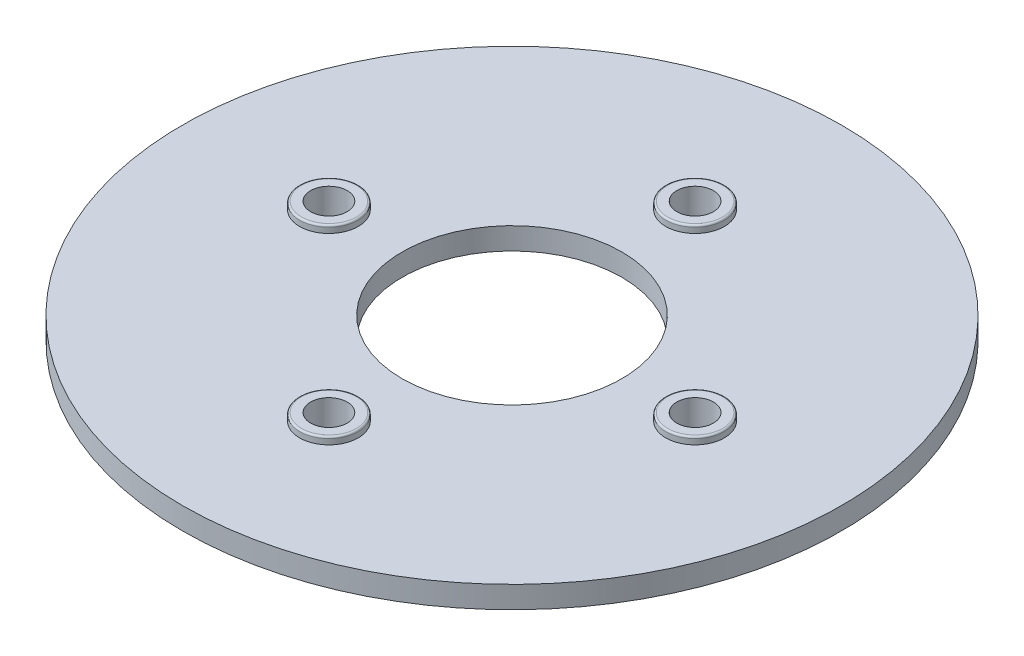
ISO-10303-21;
HEADER;
FILE_DESCRIPTION(('STEP AP214'),'2;1');
FILE_NAME('part.step','',(''),(''),'','','');
FILE_SCHEMA(('AUTOMOTIVE_DESIGN { 1 0 10303 214 1 1 1 1 }'));
ENDSEC;
DATA;
#1=APPLICATION_CONTEXT('core data for automotive mechanical design processes');
#2=APPLICATION_PROTOCOL_DEFINITION('international standard','automotive_design',2000,#1);
#3=PRODUCT_CONTEXT('',#1,'mechanical');
#4=PRODUCT('Part','Part','',(#3));
#5=PRODUCT_RELATED_PRODUCT_CATEGORY('part','',(#4));
#6=PRODUCT_DEFINITION_FORMATION('','',#4);
#7=PRODUCT_DEFINITION_CONTEXT('part definition',#1,'design');
#8=PRODUCT_DEFINITION('design','',#6,#7);
#9=PRODUCT_DEFINITION_SHAPE('','',#8);
#10=(LENGTH_UNIT() NAMED_UNIT(*) SI_UNIT(.MILLI.,.METRE.));
#11=(NAMED_UNIT(*) PLANE_ANGLE_UNIT() SI_UNIT($,.RADIAN.));
#12=(NAMED_UNIT(*) SI_UNIT($,.STERADIAN.) SOLID_ANGLE_UNIT());
#13=UNCERTAINTY_MEASURE_WITH_UNIT(LENGTH_MEASURE(1.E-05),#10,'distance_accuracy_value','');
#14=(GEOMETRIC_REPRESENTATION_CONTEXT(3) GLOBAL_UNCERTAINTY_ASSIGNED_CONTEXT((#13)) GLOBAL_UNIT_ASSIGNED_CONTEXT((#10,
#11,#12)) REPRESENTATION_CONTEXT('',''));
#15=CARTESIAN_POINT('',(0.,0.,0.));
#16=DIRECTION('',(0.,0.,1.));
#17=DIRECTION('',(1.,0.,0.));
#18=AXIS2_PLACEMENT_3D('',#15,#16,#17);
#19=CARTESIAN_POINT('',(0.,3.,0.));
#20=DIRECTION('',(0.,1.,0.));
#21=DIRECTION('',(0.,0.,1.));
#22=AXIS2_PLACEMENT_3D('',#19,#20,#21);
#23=PLANE('',#22);
#24=CARTESIAN_POINT('',(-1.58647468746875E-12,3.,25.));
#25=DIRECTION('',(0.,1.,0.));
#26=DIRECTION('',(0.,0.,1.));
#27=AXIS2_PLACEMENT_3D('',#24,#25,#26);
#28=CIRCLE('',#27,4.);
#29=CARTESIAN_POINT('',(-1.58647468746875E-12,3.,29.));
#30=VERTEX_POINT('',#29);
#31=EDGE_CURVE('E97',#30,#30,#28,.T.);
#32=ORIENTED_EDGE('',*,*,#31,.F.);
#33=EDGE_LOOP('',(#32));
#34=FACE_BOUND('',#33,.T.);
#35=CARTESIAN_POINT('',(-25.,3.,-1.67376172093983E-12));
#36=DIRECTION('',(0.,1.,0.));
#37=DIRECTION('',(0.,0.,1.));
#38=AXIS2_PLACEMENT_3D('',#35,#36,#37);
#39=CIRCLE('',#38,4.);
#40=CARTESIAN_POINT('',(-25.,3.,3.99999999999833));
#41=VERTEX_POINT('',#40);
#42=EDGE_CURVE('E91',#41,#41,#39,.T.);
#43=ORIENTED_EDGE('',*,*,#42,.F.);
#44=EDGE_LOOP('',(#43));
#45=FACE_BOUND('',#44,.T.);
#46=CARTESIAN_POINT('',(0.,3.,0.));
#47=DIRECTION('',(0.,1.,0.));
#48=DIRECTION('',(0.,0.,1.));
#49=AXIS2_PLACEMENT_3D('',#46,#47,#48);
#50=CIRCLE('',#49,45.);
#51=CARTESIAN_POINT('',(0.,3.,45.));
#52=VERTEX_POINT('',#51);
#53=EDGE_CURVE('E70',#52,#52,#50,.T.);
#54=ORIENTED_EDGE('',*,*,#53,.T.);
#55=EDGE_LOOP('',(#54));
#56=FACE_BOUND('',#55,.T.);
#57=CARTESIAN_POINT('',(0.,3.,0.));
#58=DIRECTION('',(0.,1.,0.));
#59=DIRECTION('',(0.,0.,1.));
#60=AXIS2_PLACEMENT_3D('',#57,#58,#59);
#61=CIRCLE('',#60,15.);
#62=CARTESIAN_POINT('',(0.,3.,15.));
#63=VERTEX_POINT('',#62);
#64=EDGE_CURVE('E66',#63,#63,#61,.T.);
#65=ORIENTED_EDGE('',*,*,#64,.F.);
#66=EDGE_LOOP('',(#65));
#67=FACE_BOUND('',#66,.T.);
#68=CARTESIAN_POINT('',(25.,3.,1.49918765399767E-12));
#69=DIRECTION('',(0.,1.,0.));
#70=DIRECTION('',(0.,0.,1.));
#71=AXIS2_PLACEMENT_3D('',#68,#69,#70);
#72=CIRCLE('',#71,4.);
#73=CARTESIAN_POINT('',(25.,3.,4.0000000000015));
#74=VERTEX_POINT('',#73);
#75=EDGE_CURVE('E103',#74,#74,#72,.T.);
#76=ORIENTED_EDGE('',*,*,#75,.F.);
#77=EDGE_LOOP('',(#76));
#78=FACE_BOUND('',#77,.T.);
#79=CARTESIAN_POINT('',(1.4119006205266E-12,3.,-25.));
#80=DIRECTION('',(0.,1.,0.));
#81=DIRECTION('',(0.,0.,1.));
#82=AXIS2_PLACEMENT_3D('',#79,#80,#81);
#83=CIRCLE('',#82,4.);
#84=CARTESIAN_POINT('',(1.4119006205266E-12,3.,-21.));
#85=VERTEX_POINT('',#84);
#86=EDGE_CURVE('E109',#85,#85,#83,.T.);
#87=ORIENTED_EDGE('',*,*,#86,.F.);
#88=EDGE_LOOP('',(#87));
#89=FACE_BOUND('',#88,.T.);
#90=ADVANCED_FACE('F34',(#34,#45,#56,#67,#78,#89),#23,.T.);
#91=CARTESIAN_POINT('',(0.,3.,0.));
#92=DIRECTION('',(0.,-1.,0.));
#93=DIRECTION('',(0.,0.,-1.));
#94=AXIS2_PLACEMENT_3D('',#91,#92,#93);
#95=CYLINDRICAL_SURFACE('',#94,45.);
#96=ORIENTED_EDGE('',*,*,#53,.F.);
#97=EDGE_LOOP('',(#96));
#98=FACE_BOUND('',#97,.T.);
#99=CARTESIAN_POINT('',(0.,0.,0.));
#100=DIRECTION('',(0.,1.,0.));
#101=DIRECTION('',(0.,0.,1.));
#102=AXIS2_PLACEMENT_3D('',#99,#100,#101);
#103=CIRCLE('',#102,45.);
#104=CARTESIAN_POINT('',(0.,0.,45.));
#105=VERTEX_POINT('',#104);
#106=EDGE_CURVE('E71',#105,#105,#103,.T.);
#107=ORIENTED_EDGE('',*,*,#106,.T.);
#108=EDGE_LOOP('',(#107));
#109=FACE_BOUND('',#108,.T.);
#110=ADVANCED_FACE('F135',(#98,#109),#95,.T.);
#111=CARTESIAN_POINT('',(1.4119006205266E-12,3.,25.));
#112=DIRECTION('',(0.,-1.,0.));
#113=DIRECTION('',(0.,0.,-1.));
#114=AXIS2_PLACEMENT_3D('',#111,#112,#113);
#115=CYLINDRICAL_SURFACE('',#114,2.50000000000152);
#116=CARTESIAN_POINT('',(1.4119006205266E-12,0.,25.));
#117=DIRECTION('',(0.,1.,0.));
#118=DIRECTION('',(0.,0.,1.));
#119=AXIS2_PLACEMENT_3D('',#116,#117,#118);
#120=CIRCLE('',#119,2.50000000000152);
#121=CARTESIAN_POINT('',(1.4119006205266E-12,0.,27.5000000000015));
#122=VERTEX_POINT('',#121);
#123=EDGE_CURVE('E74',#122,#122,#120,.T.);
#124=ORIENTED_EDGE('',*,*,#123,.F.);
#125=EDGE_LOOP('',(#124));
#126=FACE_BOUND('',#125,.T.);
#127=CARTESIAN_POINT('',(1.4119006205266E-12,4.,25.));
#128=DIRECTION('',(0.,1.,0.));
#129=DIRECTION('',(0.,0.,1.));
#130=AXIS2_PLACEMENT_3D('',#127,#128,#129);
#131=CIRCLE('',#130,2.50000000000152);
#132=CARTESIAN_POINT('',(1.4119006205266E-12,4.,27.5000000000015));
#133=VERTEX_POINT('',#132);
#134=EDGE_CURVE('E94',#133,#133,#131,.F.);
#135=ORIENTED_EDGE('',*,*,#134,.F.);
#136=EDGE_LOOP('',(#135));
#137=FACE_BOUND('',#136,.T.);
#138=ADVANCED_FACE('F130',(#126,#137),#115,.F.);
#139=CARTESIAN_POINT('',(25.0000000000007,3.,-7.05950310263298E-13));
#140=DIRECTION('',(0.,-1.,0.));
#141=DIRECTION('',(0.,0.,-1.));
#142=AXIS2_PLACEMENT_3D('',#139,#140,#141);
#143=CYLINDRICAL_SURFACE('',#142,2.50000000000055);
#144=CARTESIAN_POINT('',(25.0000000000007,0.,-7.05950310263298E-13));
#145=DIRECTION('',(0.,1.,0.));
#146=DIRECTION('',(0.,0.,1.));
#147=AXIS2_PLACEMENT_3D('',#144,#145,#146);
#148=CIRCLE('',#147,2.50000000000055);
#149=CARTESIAN_POINT('',(25.0000000000007,0.,2.49999999999985));
#150=VERTEX_POINT('',#149);
#151=EDGE_CURVE('E77',#150,#150,#148,.T.);
#152=ORIENTED_EDGE('',*,*,#151,.F.);
#153=EDGE_LOOP('',(#152));
#154=FACE_BOUND('',#153,.T.);
#155=CARTESIAN_POINT('',(25.0000000000007,4.,-7.05950310263298E-13));
#156=DIRECTION('',(0.,1.,0.));
#157=DIRECTION('',(0.,0.,1.));
#158=AXIS2_PLACEMENT_3D('',#155,#156,#157);
#159=CIRCLE('',#158,2.50000000000055);
#160=CARTESIAN_POINT('',(25.0000000000007,4.,2.49999999999985));
#161=VERTEX_POINT('',#160);
#162=EDGE_CURVE('E100',#161,#161,#159,.F.);
#163=ORIENTED_EDGE('',*,*,#162,.F.);
#164=EDGE_LOOP('',(#163));
#165=FACE_BOUND('',#164,.T.);
#166=ADVANCED_FACE('F120',(#154,#165),#143,.F.);
#167=CARTESIAN_POINT('',(0.,3.,-25.));
#168=DIRECTION('',(0.,-1.,0.));
#169=DIRECTION('',(0.,0.,-1.));
#170=AXIS2_PLACEMENT_3D('',#167,#168,#169);
#171=CYLINDRICAL_SURFACE('',#170,2.5);
#172=CARTESIAN_POINT('',(0.,0.,-25.));
#173=DIRECTION('',(0.,1.,0.));
#174=DIRECTION('',(0.,0.,1.));
#175=AXIS2_PLACEMENT_3D('',#172,#173,#174);
#176=CIRCLE('',#175,2.5);
#177=CARTESIAN_POINT('',(0.,0.,-22.5));
#178=VERTEX_POINT('',#177);
#179=EDGE_CURVE('E80',#178,#178,#176,.T.);
#180=ORIENTED_EDGE('',*,*,#179,.F.);
#181=EDGE_LOOP('',(#180));
#182=FACE_BOUND('',#181,.T.);
#183=CARTESIAN_POINT('',(0.,4.,-25.));
#184=DIRECTION('',(0.,1.,0.));
#185=DIRECTION('',(0.,0.,1.));
#186=AXIS2_PLACEMENT_3D('',#183,#184,#185);
#187=CIRCLE('',#186,2.5);
#188=CARTESIAN_POINT('',(0.,4.,-22.5));
#189=VERTEX_POINT('',#188);
#190=EDGE_CURVE('E106',#189,#189,#187,.F.);
#191=ORIENTED_EDGE('',*,*,#190,.F.);
#192=EDGE_LOOP('',(#191));
#193=FACE_BOUND('',#192,.T.);
#194=ADVANCED_FACE('F117',(#182,#193),#171,.F.);
#195=CARTESIAN_POINT('',(-24.9999999999993,3.,7.09011927261166E-13));
#196=DIRECTION('',(0.,-1.,0.));
#197=DIRECTION('',(0.,0.,-1.));
#198=AXIS2_PLACEMENT_3D('',#195,#196,#197);
#199=CYLINDRICAL_SURFACE('',#198,2.50000000000113);
#200=CARTESIAN_POINT('',(-24.9999999999993,0.,7.09011927261166E-13));
#201=DIRECTION('',(0.,1.,0.));
#202=DIRECTION('',(0.,0.,1.));
#203=AXIS2_PLACEMENT_3D('',#200,#201,#202);
#204=CIRCLE('',#203,2.50000000000113);
#205=CARTESIAN_POINT('',(-24.9999999999993,0.,2.50000000000184));
#206=VERTEX_POINT('',#205);
#207=EDGE_CURVE('E83',#206,#206,#204,.T.);
#208=ORIENTED_EDGE('',*,*,#207,.F.);
#209=EDGE_LOOP('',(#208));
#210=FACE_BOUND('',#209,.T.);
#211=CARTESIAN_POINT('',(-24.9999999999993,4.,7.09011927261166E-13));
#212=DIRECTION('',(0.,1.,0.));
#213=DIRECTION('',(0.,0.,1.));
#214=AXIS2_PLACEMENT_3D('',#211,#212,#213);
#215=CIRCLE('',#214,2.50000000000113);
#216=CARTESIAN_POINT('',(-24.9999999999993,4.,2.50000000000184));
#217=VERTEX_POINT('',#216);
#218=EDGE_CURVE('E86',#217,#217,#215,.F.);
#219=ORIENTED_EDGE('',*,*,#218,.F.);
#220=EDGE_LOOP('',(#219));
#221=FACE_BOUND('',#220,.T.);
#222=ADVANCED_FACE('F119',(#210,#221),#199,.F.);
#223=CARTESIAN_POINT('',(0.,3.,0.));
#224=DIRECTION('',(0.,-1.,0.));
#225=DIRECTION('',(0.,0.,-1.));
#226=AXIS2_PLACEMENT_3D('',#223,#224,#225);
#227=CYLINDRICAL_SURFACE('',#226,15.);
#228=ORIENTED_EDGE('',*,*,#64,.T.);
#229=EDGE_LOOP('',(#228));
#230=FACE_BOUND('',#229,.T.);
#231=CARTESIAN_POINT('',(0.,0.,0.));
#232=DIRECTION('',(0.,1.,0.));
#233=DIRECTION('',(0.,0.,1.));
#234=AXIS2_PLACEMENT_3D('',#231,#232,#233);
#235=CIRCLE('',#234,15.);
#236=CARTESIAN_POINT('',(0.,0.,15.));
#237=VERTEX_POINT('',#236);
#238=EDGE_CURVE('E67',#237,#237,#235,.T.);
#239=ORIENTED_EDGE('',*,*,#238,.F.);
#240=EDGE_LOOP('',(#239));
#241=FACE_BOUND('',#240,.T.);
#242=ADVANCED_FACE('F127',(#230,#241),#227,.F.);
#243=CARTESIAN_POINT('',(0.,0.,0.));
#244=DIRECTION('',(0.,1.,0.));
#245=DIRECTION('',(0.,0.,1.));
#246=AXIS2_PLACEMENT_3D('',#243,#244,#245);
#247=PLANE('',#246);
#248=ORIENTED_EDGE('',*,*,#207,.T.);
#249=EDGE_LOOP('',(#248));
#250=FACE_BOUND('',#249,.T.);
#251=ORIENTED_EDGE('',*,*,#179,.T.);
#252=EDGE_LOOP('',(#251));
#253=FACE_BOUND('',#252,.T.);
#254=ORIENTED_EDGE('',*,*,#151,.T.);
#255=EDGE_LOOP('',(#254));
#256=FACE_BOUND('',#255,.T.);
#257=ORIENTED_EDGE('',*,*,#123,.T.);
#258=EDGE_LOOP('',(#257));
#259=FACE_BOUND('',#258,.T.);
#260=ORIENTED_EDGE('',*,*,#106,.F.);
#261=EDGE_LOOP('',(#260));
#262=FACE_BOUND('',#261,.T.);
#263=ORIENTED_EDGE('',*,*,#238,.T.);
#264=EDGE_LOOP('',(#263));
#265=FACE_BOUND('',#264,.T.);
#266=ADVANCED_FACE('F149',(#250,#253,#256,#259,#262,#265),#247,.F.);
#267=CARTESIAN_POINT('',(-25.,4.,-1.67376172093983E-12));
#268=DIRECTION('',(0.,-1.,0.));
#269=DIRECTION('',(0.,0.,-1.));
#270=AXIS2_PLACEMENT_3D('',#267,#268,#269);
#271=CYLINDRICAL_SURFACE('',#270,4.);
#272=CARTESIAN_POINT('',(-25.,3.75,-1.67376172093983E-12));
#273=DIRECTION('',(0.,1.,0.));
#274=DIRECTION('',(0.,0.,1.));
#275=AXIS2_PLACEMENT_3D('',#272,#273,#274);
#276=CIRCLE('',#275,4.);
#277=CARTESIAN_POINT('',(-25.,3.75,3.99999999999833));
#278=VERTEX_POINT('',#277);
#279=EDGE_CURVE('E45',#278,#278,#276,.F.);
#280=ORIENTED_EDGE('',*,*,#279,.T.);
#281=EDGE_LOOP('',(#280));
#282=FACE_BOUND('',#281,.T.);
#283=ORIENTED_EDGE('',*,*,#42,.T.);
#284=EDGE_LOOP('',(#283));
#285=FACE_BOUND('',#284,.T.);
#286=ADVANCED_FACE('F147',(#282,#285),#271,.T.);
#287=CARTESIAN_POINT('',(0.,4.,0.));
#288=DIRECTION('',(0.,1.,0.));
#289=DIRECTION('',(0.,0.,1.));
#290=AXIS2_PLACEMENT_3D('',#287,#288,#289);
#291=PLANE('',#290);
#292=CARTESIAN_POINT('',(-25.,4.,-1.67376172093983E-12));
#293=DIRECTION('',(0.,1.,0.));
#294=DIRECTION('',(0.,0.,1.));
#295=AXIS2_PLACEMENT_3D('',#292,#293,#294);
#296=CIRCLE('',#295,3.75);
#297=CARTESIAN_POINT('',(-25.,4.,3.74999999999833));
#298=VERTEX_POINT('',#297);
#299=EDGE_CURVE('E49',#298,#298,#296,.T.);
#300=ORIENTED_EDGE('',*,*,#299,.T.);
#301=EDGE_LOOP('',(#300));
#302=FACE_BOUND('',#301,.T.);
#303=ORIENTED_EDGE('',*,*,#218,.T.);
#304=EDGE_LOOP('',(#303));
#305=FACE_BOUND('',#304,.T.);
#306=ADVANCED_FACE('F177',(#302,#305),#291,.T.);
#307=CARTESIAN_POINT('',(-1.58647468746875E-12,4.,25.));
#308=DIRECTION('',(0.,-1.,0.));
#309=DIRECTION('',(0.,0.,-1.));
#310=AXIS2_PLACEMENT_3D('',#307,#308,#309);
#311=CYLINDRICAL_SURFACE('',#310,4.);
#312=CARTESIAN_POINT('',(-1.58647468746875E-12,3.75,25.));
#313=DIRECTION('',(0.,1.,0.));
#314=DIRECTION('',(0.,0.,1.));
#315=AXIS2_PLACEMENT_3D('',#312,#313,#314);
#316=CIRCLE('',#315,4.);
#317=CARTESIAN_POINT('',(-1.58647468746875E-12,3.75,29.));
#318=VERTEX_POINT('',#317);
#319=EDGE_CURVE('E54',#318,#318,#316,.F.);
#320=ORIENTED_EDGE('',*,*,#319,.T.);
#321=EDGE_LOOP('',(#320));
#322=FACE_BOUND('',#321,.T.);
#323=ORIENTED_EDGE('',*,*,#31,.T.);
#324=EDGE_LOOP('',(#323));
#325=FACE_BOUND('',#324,.T.);
#326=ADVANCED_FACE('F167',(#322,#325),#311,.T.);
#327=CARTESIAN_POINT('',(0.,4.,0.));
#328=DIRECTION('',(0.,1.,0.));
#329=DIRECTION('',(0.,0.,1.));
#330=AXIS2_PLACEMENT_3D('',#327,#328,#329);
#331=PLANE('',#330);
#332=CARTESIAN_POINT('',(-1.58647468746875E-12,4.,25.));
#333=DIRECTION('',(0.,1.,0.));
#334=DIRECTION('',(0.,0.,1.));
#335=AXIS2_PLACEMENT_3D('',#332,#333,#334);
#336=CIRCLE('',#335,3.75);
#337=CARTESIAN_POINT('',(-1.58647468746875E-12,4.,28.75));
#338=VERTEX_POINT('',#337);
#339=EDGE_CURVE('E57',#338,#338,#336,.T.);
#340=ORIENTED_EDGE('',*,*,#339,.T.);
#341=EDGE_LOOP('',(#340));
#342=FACE_BOUND('',#341,.T.);
#343=ORIENTED_EDGE('',*,*,#134,.T.);
#344=EDGE_LOOP('',(#343));
#345=FACE_BOUND('',#344,.T.);
#346=ADVANCED_FACE('F164',(#342,#345),#331,.T.);
#347=CARTESIAN_POINT('',(25.,4.,1.49918765399767E-12));
#348=DIRECTION('',(0.,-1.,0.));
#349=DIRECTION('',(0.,0.,-1.));
#350=AXIS2_PLACEMENT_3D('',#347,#348,#349);
#351=CYLINDRICAL_SURFACE('',#350,4.);
#352=CARTESIAN_POINT('',(25.,3.75,1.49918765399767E-12));
#353=DIRECTION('',(0.,1.,0.));
#354=DIRECTION('',(0.,0.,1.));
#355=AXIS2_PLACEMENT_3D('',#352,#353,#354);
#356=CIRCLE('',#355,4.);
#357=CARTESIAN_POINT('',(25.,3.75,4.0000000000015));
#358=VERTEX_POINT('',#357);
#359=EDGE_CURVE('E60',#358,#358,#356,.F.);
#360=ORIENTED_EDGE('',*,*,#359,.T.);
#361=EDGE_LOOP('',(#360));
#362=FACE_BOUND('',#361,.T.);
#363=ORIENTED_EDGE('',*,*,#75,.T.);
#364=EDGE_LOOP('',(#363));
#365=FACE_BOUND('',#364,.T.);
#366=ADVANCED_FACE('F166',(#362,#365),#351,.T.);
#367=CARTESIAN_POINT('',(0.,4.,0.));
#368=DIRECTION('',(0.,1.,0.));
#369=DIRECTION('',(0.,0.,1.));
#370=AXIS2_PLACEMENT_3D('',#367,#368,#369);
#371=PLANE('',#370);
#372=CARTESIAN_POINT('',(25.,4.,1.49918765399767E-12));
#373=DIRECTION('',(0.,1.,0.));
#374=DIRECTION('',(0.,0.,1.));
#375=AXIS2_PLACEMENT_3D('',#372,#373,#374);
#376=CIRCLE('',#375,3.75);
#377=CARTESIAN_POINT('',(25.,4.,3.7500000000015));
#378=VERTEX_POINT('',#377);
#379=EDGE_CURVE('E63',#378,#378,#376,.T.);
#380=ORIENTED_EDGE('',*,*,#379,.T.);
#381=EDGE_LOOP('',(#380));
#382=FACE_BOUND('',#381,.T.);
#383=ORIENTED_EDGE('',*,*,#162,.T.);
#384=EDGE_LOOP('',(#383));
#385=FACE_BOUND('',#384,.T.);
#386=ADVANCED_FACE('F174',(#382,#385),#371,.T.);
#387=CARTESIAN_POINT('',(1.4119006205266E-12,4.,-25.));
#388=DIRECTION('',(0.,-1.,0.));
#389=DIRECTION('',(0.,0.,-1.));
#390=AXIS2_PLACEMENT_3D('',#387,#388,#389);
#391=CYLINDRICAL_SURFACE('',#390,4.);
#392=CARTESIAN_POINT('',(1.4119006205266E-12,3.75,-25.));
#393=DIRECTION('',(0.,1.,0.));
#394=DIRECTION('',(0.,0.,1.));
#395=AXIS2_PLACEMENT_3D('',#392,#393,#394);
#396=CIRCLE('',#395,4.);
#397=CARTESIAN_POINT('',(1.4119006205266E-12,3.75,-21.));
#398=VERTEX_POINT('',#397);
#399=EDGE_CURVE('E10',#398,#398,#396,.F.);
#400=ORIENTED_EDGE('',*,*,#399,.T.);
#401=EDGE_LOOP('',(#400));
#402=FACE_BOUND('',#401,.T.);
#403=ORIENTED_EDGE('',*,*,#86,.T.);
#404=EDGE_LOOP('',(#403));
#405=FACE_BOUND('',#404,.T.);
#406=ADVANCED_FACE('F211',(#402,#405),#391,.T.);
#407=CARTESIAN_POINT('',(0.,4.,0.));
#408=DIRECTION('',(0.,1.,0.));
#409=DIRECTION('',(0.,0.,1.));
#410=AXIS2_PLACEMENT_3D('',#407,#408,#409);
#411=PLANE('',#410);
#412=CARTESIAN_POINT('',(1.4119006205266E-12,4.,-25.));
#413=DIRECTION('',(0.,1.,0.));
#414=DIRECTION('',(0.,0.,1.));
#415=AXIS2_PLACEMENT_3D('',#412,#413,#414);
#416=CIRCLE('',#415,3.75);
#417=CARTESIAN_POINT('',(1.4119006205266E-12,4.,-21.25));
#418=VERTEX_POINT('',#417);
#419=EDGE_CURVE('E41',#418,#418,#416,.T.);
#420=ORIENTED_EDGE('',*,*,#419,.T.);
#421=EDGE_LOOP('',(#420));
#422=FACE_BOUND('',#421,.T.);
#423=ORIENTED_EDGE('',*,*,#190,.T.);
#424=EDGE_LOOP('',(#423));
#425=FACE_BOUND('',#424,.T.);
#426=ADVANCED_FACE('F115',(#422,#425),#411,.T.);
#427=CARTESIAN_POINT('',(25.,3.75,1.49918765399767E-12));
#428=DIRECTION('',(0.,1.,0.));
#429=DIRECTION('',(0.,0.,1.));
#430=AXIS2_PLACEMENT_3D('',#427,#428,#429);
#431=TOROIDAL_SURFACE('',#430,3.75,0.25);
#432=ORIENTED_EDGE('',*,*,#359,.F.);
#433=EDGE_LOOP('',(#432));
#434=FACE_BOUND('',#433,.T.);
#435=ORIENTED_EDGE('',*,*,#379,.F.);
#436=EDGE_LOOP('',(#435));
#437=FACE_BOUND('',#436,.T.);
#438=ADVANCED_FACE('F201',(#434,#437),#431,.T.);
#439=CARTESIAN_POINT('',(-1.58647468746875E-12,3.75,25.));
#440=DIRECTION('',(0.,1.,0.));
#441=DIRECTION('',(0.,0.,1.));
#442=AXIS2_PLACEMENT_3D('',#439,#440,#441);
#443=TOROIDAL_SURFACE('',#442,3.75,0.25);
#444=ORIENTED_EDGE('',*,*,#319,.F.);
#445=EDGE_LOOP('',(#444));
#446=FACE_BOUND('',#445,.T.);
#447=ORIENTED_EDGE('',*,*,#339,.F.);
#448=EDGE_LOOP('',(#447));
#449=FACE_BOUND('',#448,.T.);
#450=ADVANCED_FACE('F194',(#446,#449),#443,.T.);
#451=CARTESIAN_POINT('',(-25.,3.75,-1.67376172093983E-12));
#452=DIRECTION('',(0.,1.,0.));
#453=DIRECTION('',(0.,0.,1.));
#454=AXIS2_PLACEMENT_3D('',#451,#452,#453);
#455=TOROIDAL_SURFACE('',#454,3.75,0.25);
#456=ORIENTED_EDGE('',*,*,#279,.F.);
#457=EDGE_LOOP('',(#456));
#458=FACE_BOUND('',#457,.T.);
#459=ORIENTED_EDGE('',*,*,#299,.F.);
#460=EDGE_LOOP('',(#459));
#461=FACE_BOUND('',#460,.T.);
#462=ADVANCED_FACE('F192',(#458,#461),#455,.T.);
#463=CARTESIAN_POINT('',(1.4119006205266E-12,3.75,-25.));
#464=DIRECTION('',(0.,1.,0.));
#465=DIRECTION('',(0.,0.,1.));
#466=AXIS2_PLACEMENT_3D('',#463,#464,#465);
#467=TOROIDAL_SURFACE('',#466,3.75,0.25);
#468=ORIENTED_EDGE('',*,*,#399,.F.);
#469=EDGE_LOOP('',(#468));
#470=FACE_BOUND('',#469,.T.);
#471=ORIENTED_EDGE('',*,*,#419,.F.);
#472=EDGE_LOOP('',(#471));
#473=FACE_BOUND('',#472,.T.);
#474=ADVANCED_FACE('F36',(#470,#473),#467,.T.);
#475=CLOSED_SHELL('',(#90,#110,#138,#166,#194,#222,#242,#266,#286,#306,#326,#346,#366,#386,#406,
#426,#438,#450,#462,#474));
#476=MANIFOLD_SOLID_BREP('B2',#475);
#477=ADVANCED_BREP_SHAPE_REPRESENTATION('',(#18,#476),#14);
#478=SHAPE_DEFINITION_REPRESENTATION(#9,#477);
ENDSEC;
END-ISO-10303-21;
